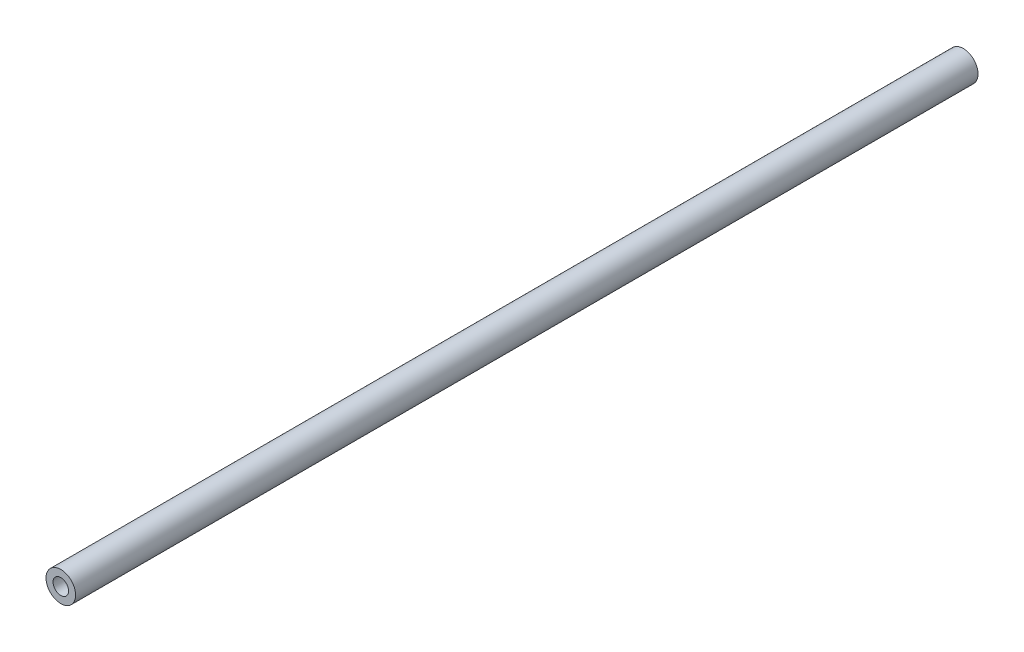
ISO-10303-21;
HEADER;
FILE_DESCRIPTION(('STEP AP214'),'2;1');
FILE_NAME('part.step','',(''),(''),'','','');
FILE_SCHEMA(('AUTOMOTIVE_DESIGN { 1 0 10303 214 1 1 1 1 }'));
ENDSEC;
DATA;
#1=APPLICATION_CONTEXT('core data for automotive mechanical design processes');
#2=APPLICATION_PROTOCOL_DEFINITION('international standard','automotive_design',2000,#1);
#3=PRODUCT_CONTEXT('',#1,'mechanical');
#4=PRODUCT('Part','Part','',(#3));
#5=PRODUCT_RELATED_PRODUCT_CATEGORY('part','',(#4));
#6=PRODUCT_DEFINITION_FORMATION('','',#4);
#7=PRODUCT_DEFINITION_CONTEXT('part definition',#1,'design');
#8=PRODUCT_DEFINITION('design','',#6,#7);
#9=PRODUCT_DEFINITION_SHAPE('','',#8);
#10=(LENGTH_UNIT() NAMED_UNIT(*) SI_UNIT(.MILLI.,.METRE.));
#11=(NAMED_UNIT(*) PLANE_ANGLE_UNIT() SI_UNIT($,.RADIAN.));
#12=(NAMED_UNIT(*) SI_UNIT($,.STERADIAN.) SOLID_ANGLE_UNIT());
#13=UNCERTAINTY_MEASURE_WITH_UNIT(LENGTH_MEASURE(1.E-05),#10,'distance_accuracy_value','');
#14=(GEOMETRIC_REPRESENTATION_CONTEXT(3) GLOBAL_UNCERTAINTY_ASSIGNED_CONTEXT((#13)) GLOBAL_UNIT_ASSIGNED_CONTEXT((#10,
#11,#12)) REPRESENTATION_CONTEXT('',''));
#15=CARTESIAN_POINT('',(0.,0.,0.));
#16=DIRECTION('',(0.,0.,1.));
#17=DIRECTION('',(1.,0.,0.));
#18=AXIS2_PLACEMENT_3D('',#15,#16,#17);
#19=CARTESIAN_POINT('',(0.,0.,121.95));
#20=DIRECTION('',(0.,0.,-1.));
#21=DIRECTION('',(-1.,0.,0.));
#22=AXIS2_PLACEMENT_3D('',#19,#20,#21);
#23=CYLINDRICAL_SURFACE('',#22,4.);
#24=CARTESIAN_POINT('',(0.,0.,121.95));
#25=DIRECTION('',(0.,0.,1.));
#26=DIRECTION('',(1.,0.,0.));
#27=AXIS2_PLACEMENT_3D('',#24,#25,#26);
#28=CIRCLE('',#27,4.);
#29=CARTESIAN_POINT('',(-4.,0.,121.95));
#30=VERTEX_POINT('',#29);
#31=EDGE_CURVE('E10',#30,#30,#28,.T.);
#32=CARTESIAN_POINT('',(0.,0.,-121.95));
#33=DIRECTION('',(0.,0.,1.));
#34=DIRECTION('',(1.,0.,0.));
#35=AXIS2_PLACEMENT_3D('',#32,#33,#34);
#36=CIRCLE('',#35,4.);
#37=CARTESIAN_POINT('',(-4.,0.,-121.95));
#38=VERTEX_POINT('',#37);
#39=EDGE_CURVE('E36',#38,#38,#36,.T.);
#40=CARTESIAN_POINT('',(-4.,0.,121.95));
#41=CARTESIAN_POINT('',(-4.,0.,119.409375));
#42=CARTESIAN_POINT('',(-4.,0.,116.86875));
#43=CARTESIAN_POINT('',(-4.,0.,111.7875));
#44=CARTESIAN_POINT('',(-4.,0.,109.246875));
#45=CARTESIAN_POINT('',(-4.,0.,104.165625));
#46=CARTESIAN_POINT('',(-4.,0.,101.625));
#47=CARTESIAN_POINT('',(-4.,0.,96.54375));
#48=CARTESIAN_POINT('',(-4.,0.,94.003125));
#49=CARTESIAN_POINT('',(-4.,0.,88.921875));
#50=CARTESIAN_POINT('',(-4.,0.,86.38125));
#51=CARTESIAN_POINT('',(-4.,0.,81.3));
#52=CARTESIAN_POINT('',(-4.,0.,78.759375));
#53=CARTESIAN_POINT('',(-4.,0.,73.678125));
#54=CARTESIAN_POINT('',(-4.,0.,71.1375));
#55=CARTESIAN_POINT('',(-4.,0.,66.05625));
#56=CARTESIAN_POINT('',(-4.,0.,63.515625));
#57=CARTESIAN_POINT('',(-4.,0.,58.434375));
#58=CARTESIAN_POINT('',(-4.,0.,55.89375));
#59=CARTESIAN_POINT('',(-4.,0.,50.8125));
#60=CARTESIAN_POINT('',(-4.,0.,48.271875));
#61=CARTESIAN_POINT('',(-4.,0.,43.190625));
#62=CARTESIAN_POINT('',(-4.,0.,40.65));
#63=CARTESIAN_POINT('',(-4.,0.,35.56875));
#64=CARTESIAN_POINT('',(-4.,0.,33.028125));
#65=CARTESIAN_POINT('',(-4.,0.,27.946875));
#66=CARTESIAN_POINT('',(-4.,0.,25.40625));
#67=CARTESIAN_POINT('',(-4.,0.,20.325));
#68=CARTESIAN_POINT('',(-4.,0.,17.784375));
#69=CARTESIAN_POINT('',(-4.,0.,12.703125));
#70=CARTESIAN_POINT('',(-4.,0.,10.1625));
#71=CARTESIAN_POINT('',(-4.,0.,5.08124999999997));
#72=CARTESIAN_POINT('',(-4.,0.,2.54062499999997));
#73=CARTESIAN_POINT('',(-4.,0.,-2.54062500000002));
#74=CARTESIAN_POINT('',(-4.,0.,-5.08125000000001));
#75=CARTESIAN_POINT('',(-4.,0.,-10.1625));
#76=CARTESIAN_POINT('',(-4.,0.,-12.703125));
#77=CARTESIAN_POINT('',(-4.,0.,-17.784375));
#78=CARTESIAN_POINT('',(-4.,0.,-20.325));
#79=CARTESIAN_POINT('',(-4.,0.,-25.40625));
#80=CARTESIAN_POINT('',(-4.,0.,-27.946875));
#81=CARTESIAN_POINT('',(-4.,0.,-33.028125));
#82=CARTESIAN_POINT('',(-4.,0.,-35.56875));
#83=CARTESIAN_POINT('',(-4.,0.,-40.65));
#84=CARTESIAN_POINT('',(-4.,0.,-43.190625));
#85=CARTESIAN_POINT('',(-4.,0.,-48.271875));
#86=CARTESIAN_POINT('',(-4.,0.,-50.8125));
#87=CARTESIAN_POINT('',(-4.,0.,-55.89375));
#88=CARTESIAN_POINT('',(-4.,0.,-58.434375));
#89=CARTESIAN_POINT('',(-4.,0.,-63.515625));
#90=CARTESIAN_POINT('',(-4.,0.,-66.05625));
#91=CARTESIAN_POINT('',(-4.,0.,-71.1375));
#92=CARTESIAN_POINT('',(-4.,0.,-73.678125));
#93=CARTESIAN_POINT('',(-4.,0.,-78.759375));
#94=CARTESIAN_POINT('',(-4.,0.,-81.3));
#95=CARTESIAN_POINT('',(-4.,0.,-86.38125));
#96=CARTESIAN_POINT('',(-4.,0.,-88.921875));
#97=CARTESIAN_POINT('',(-4.,0.,-94.003125));
#98=CARTESIAN_POINT('',(-4.,0.,-96.54375));
#99=CARTESIAN_POINT('',(-4.,0.,-101.625));
#100=CARTESIAN_POINT('',(-4.,0.,-104.165625));
#101=CARTESIAN_POINT('',(-4.,0.,-109.246875));
#102=CARTESIAN_POINT('',(-4.,0.,-111.7875));
#103=CARTESIAN_POINT('',(-4.,0.,-116.86875));
#104=CARTESIAN_POINT('',(-4.,0.,-119.409375));
#105=CARTESIAN_POINT('',(-4.,0.,-121.95));
#106=B_SPLINE_CURVE_WITH_KNOTS('',3,(#40,#41,#42,#43,#44,#45,#46,#47,#48,#49,#50,#51,#52,#53,
#54,#55,#56,#57,#58,#59,#60,#61,#62,#63,#64,#65,#66,#67,#68,#69,#70,#71,#72,#73,#74,#75,#76,#77,
#78,#79,#80,#81,#82,#83,#84,#85,#86,#87,#88,#89,#90,#91,#92,#93,#94,#95,#96,#97,#98,#99,#100,
#101,#102,#103,#104,#105),.UNSPECIFIED.,.F.,.F.,(4,2,2,2,2,2,2,2,2,2,2,2,2,2,2,2,2,2,2,2,2,2,2,
2,2,2,2,2,2,2,2,2,4),(0.,7.621875,15.24375,22.865625,30.4875,38.109375,45.73125,53.353125,
60.975,68.596875,76.21875,83.840625,91.4625,99.084375,106.70625,114.328125,121.95,129.571875,
137.19375,144.815625,152.4375,160.059375,167.68125,175.303125,182.925,190.546875,198.16875,
205.790625,213.4125,221.034375,228.65625,236.278125,243.9),.UNSPECIFIED.);
#107=EDGE_CURVE('BSEAM33',#30,#38,#106,.T.);
#108=ORIENTED_EDGE('',*,*,#31,.F.);
#109=ORIENTED_EDGE('',*,*,#39,.T.);
#110=ORIENTED_EDGE('',*,*,#107,.T.);
#111=ORIENTED_EDGE('',*,*,#107,.F.);
#112=EDGE_LOOP('',(#108,#110,#109,#111));
#113=FACE_BOUND('',#112,.T.);
#114=ADVANCED_FACE('F33',(#113),#23,.T.);
#115=CARTESIAN_POINT('',(0.,0.,121.95));
#116=DIRECTION('',(0.,0.,1.));
#117=DIRECTION('',(1.,0.,0.));
#118=AXIS2_PLACEMENT_3D('',#115,#116,#117);
#119=PLANE('',#118);
#120=CARTESIAN_POINT('',(0.,0.,121.95));
#121=DIRECTION('',(0.,0.,1.));
#122=DIRECTION('',(1.,0.,0.));
#123=AXIS2_PLACEMENT_3D('',#120,#121,#122);
#124=CIRCLE('',#123,2.09999999999999);
#125=CARTESIAN_POINT('',(2.09999999999999,0.,121.95));
#126=VERTEX_POINT('',#125);
#127=EDGE_CURVE('E47',#126,#126,#124,.T.);
#128=ORIENTED_EDGE('',*,*,#127,.F.);
#129=EDGE_LOOP('',(#128));
#130=FACE_BOUND('',#129,.T.);
#131=ORIENTED_EDGE('',*,*,#31,.T.);
#132=EDGE_LOOP('',(#131));
#133=FACE_BOUND('',#132,.T.);
#134=ADVANCED_FACE('F53',(#130,#133),#119,.T.);
#135=CARTESIAN_POINT('',(0.,0.,-121.95));
#136=DIRECTION('',(0.,0.,1.));
#137=DIRECTION('',(1.,0.,0.));
#138=AXIS2_PLACEMENT_3D('',#135,#136,#137);
#139=PLANE('',#138);
#140=CARTESIAN_POINT('',(0.,0.,-121.95));
#141=DIRECTION('',(0.,0.,1.));
#142=DIRECTION('',(1.,0.,0.));
#143=AXIS2_PLACEMENT_3D('',#140,#141,#142);
#144=CIRCLE('',#143,2.09999999999997);
#145=CARTESIAN_POINT('',(2.09999999999997,0.,-121.95));
#146=VERTEX_POINT('',#145);
#147=EDGE_CURVE('E43',#146,#146,#144,.T.);
#148=ORIENTED_EDGE('',*,*,#147,.T.);
#149=EDGE_LOOP('',(#148));
#150=FACE_BOUND('',#149,.T.);
#151=ORIENTED_EDGE('',*,*,#39,.F.);
#152=EDGE_LOOP('',(#151));
#153=FACE_BOUND('',#152,.T.);
#154=ADVANCED_FACE('F55',(#150,#153),#139,.F.);
#155=CARTESIAN_POINT('',(0.,0.,121.95));
#156=DIRECTION('',(0.,0.,1.));
#157=DIRECTION('',(1.,0.,0.));
#158=AXIS2_PLACEMENT_3D('',#155,#156,#157);
#159=CYLINDRICAL_SURFACE('',#158,2.09999999999998);
#160=ORIENTED_EDGE('',*,*,#147,.F.);
#161=EDGE_LOOP('',(#160));
#162=FACE_BOUND('',#161,.T.);
#163=ORIENTED_EDGE('',*,*,#127,.T.);
#164=EDGE_LOOP('',(#163));
#165=FACE_BOUND('',#164,.T.);
#166=ADVANCED_FACE('F51',(#162,#165),#159,.F.);
#167=CLOSED_SHELL('',(#114,#134,#154,#166));
#168=MANIFOLD_SOLID_BREP('B2',#167);
#169=ADVANCED_BREP_SHAPE_REPRESENTATION('',(#18,#168),#14);
#170=SHAPE_DEFINITION_REPRESENTATION(#9,#169);
ENDSEC;
END-ISO-10303-21;
